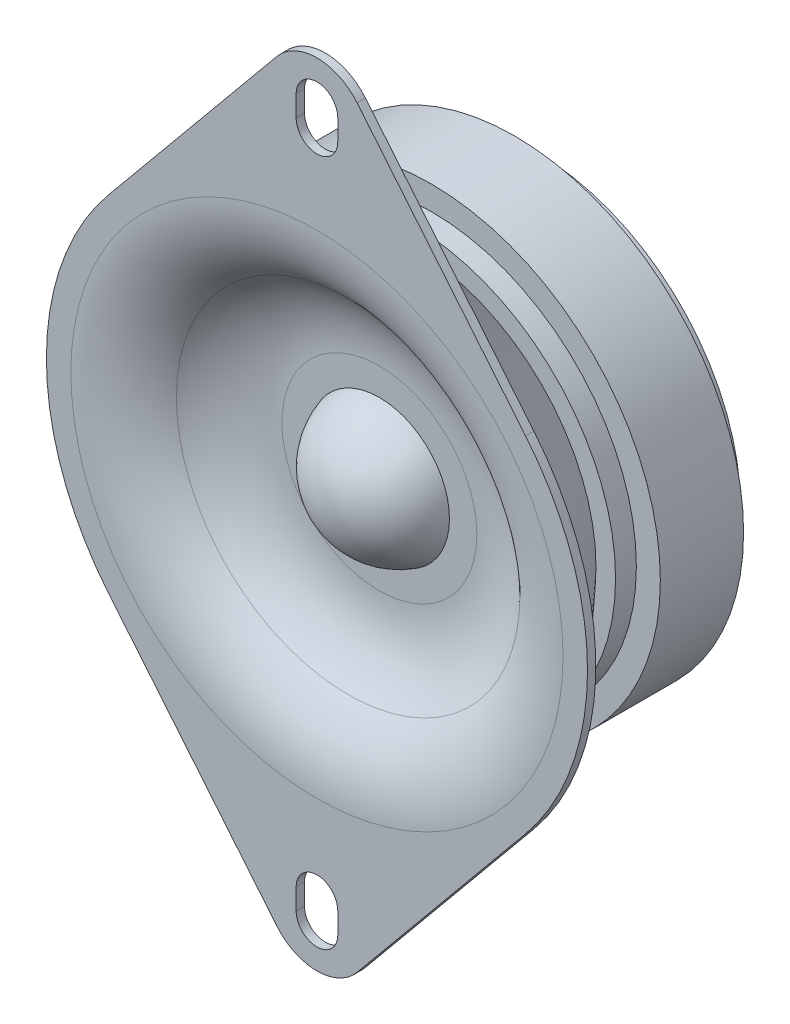
ISO-10303-21;
HEADER;
FILE_DESCRIPTION(('STEP AP214'),'2;1');
FILE_NAME('part.step','',(''),(''),'','','');
FILE_SCHEMA(('AUTOMOTIVE_DESIGN { 1 0 10303 214 1 1 1 1 }'));
ENDSEC;
DATA;
#1=APPLICATION_CONTEXT('core data for automotive mechanical design processes');
#2=APPLICATION_PROTOCOL_DEFINITION('international standard','automotive_design',2000,#1);
#3=PRODUCT_CONTEXT('',#1,'mechanical');
#4=PRODUCT('Part','Part','',(#3));
#5=PRODUCT_RELATED_PRODUCT_CATEGORY('part','',(#4));
#6=PRODUCT_DEFINITION_FORMATION('','',#4);
#7=PRODUCT_DEFINITION_CONTEXT('part definition',#1,'design');
#8=PRODUCT_DEFINITION('design','',#6,#7);
#9=PRODUCT_DEFINITION_SHAPE('','',#8);
#10=(LENGTH_UNIT() NAMED_UNIT(*) SI_UNIT(.MILLI.,.METRE.));
#11=(NAMED_UNIT(*) PLANE_ANGLE_UNIT() SI_UNIT($,.RADIAN.));
#12=(NAMED_UNIT(*) SI_UNIT($,.STERADIAN.) SOLID_ANGLE_UNIT());
#13=UNCERTAINTY_MEASURE_WITH_UNIT(LENGTH_MEASURE(1.E-05),#10,'distance_accuracy_value','');
#14=(GEOMETRIC_REPRESENTATION_CONTEXT(3) GLOBAL_UNCERTAINTY_ASSIGNED_CONTEXT((#13)) GLOBAL_UNIT_ASSIGNED_CONTEXT((#10,
#11,#12)) REPRESENTATION_CONTEXT('',''));
#15=CARTESIAN_POINT('',(0.,0.,0.));
#16=DIRECTION('',(0.,0.,1.));
#17=DIRECTION('',(1.,0.,0.));
#18=AXIS2_PLACEMENT_3D('',#15,#16,#17);
#19=CARTESIAN_POINT('',(0.,0.,-11.));
#20=DIRECTION('',(0.,0.,1.));
#21=DIRECTION('',(1.,0.,0.));
#22=AXIS2_PLACEMENT_3D('',#19,#20,#21);
#23=CONICAL_SURFACE('',#22,16.,0.737815060120465);
#24=CARTESIAN_POINT('',(0.,0.,-9.));
#25=DIRECTION('',(0.,0.,-1.));
#26=DIRECTION('',(-1.,0.,0.));
#27=AXIS2_PLACEMENT_3D('',#24,#25,#26);
#28=CIRCLE('',#27,17.8181818181818);
#29=CARTESIAN_POINT('',(-17.8181818181818,0.,-9.));
#30=VERTEX_POINT('',#29);
#31=EDGE_CURVE('E327',#30,#30,#28,.F.);
#32=ORIENTED_EDGE('',*,*,#31,.T.);
#33=EDGE_LOOP('',(#32));
#34=FACE_BOUND('',#33,.T.);
#35=CARTESIAN_POINT('',(0.,0.,-0.8));
#36=DIRECTION('',(0.,0.,1.));
#37=DIRECTION('',(1.,0.,0.));
#38=AXIS2_PLACEMENT_3D('',#35,#36,#37);
#39=CIRCLE('',#38,25.2727272727273);
#40=CARTESIAN_POINT('',(25.2727272727273,0.,-0.8));
#41=VERTEX_POINT('',#40);
#42=EDGE_CURVE('E241',#41,#41,#39,.F.);
#43=ORIENTED_EDGE('',*,*,#42,.T.);
#44=EDGE_LOOP('',(#43));
#45=FACE_BOUND('',#44,.T.);
#46=ADVANCED_FACE('F31',(#34,#45),#23,.T.);
#47=CARTESIAN_POINT('',(0.,0.,-9.));
#48=DIRECTION('',(0.,0.,-1.));
#49=DIRECTION('',(-1.,0.,0.));
#50=AXIS2_PLACEMENT_3D('',#47,#48,#49);
#51=CYLINDRICAL_SURFACE('',#50,19.6963799452105);
#52=CARTESIAN_POINT('',(0.,0.,-9.));
#53=DIRECTION('',(0.,0.,-1.));
#54=DIRECTION('',(-1.,0.,0.));
#55=AXIS2_PLACEMENT_3D('',#52,#53,#54);
#56=CIRCLE('',#55,19.6963799452105);
#57=CARTESIAN_POINT('',(-19.6963799452105,0.,-9.));
#58=VERTEX_POINT('',#57);
#59=EDGE_CURVE('E334',#58,#58,#56,.T.);
#60=ORIENTED_EDGE('',*,*,#59,.T.);
#61=EDGE_LOOP('',(#60));
#62=FACE_BOUND('',#61,.T.);
#63=CARTESIAN_POINT('',(0.,0.,-11.));
#64=DIRECTION('',(0.,0.,-1.));
#65=DIRECTION('',(-1.,0.,0.));
#66=AXIS2_PLACEMENT_3D('',#63,#64,#65);
#67=CIRCLE('',#66,19.6963799452105);
#68=CARTESIAN_POINT('',(-19.6963799452105,0.,-11.));
#69=VERTEX_POINT('',#68);
#70=EDGE_CURVE('E410',#69,#69,#67,.T.);
#71=ORIENTED_EDGE('',*,*,#70,.F.);
#72=EDGE_LOOP('',(#71));
#73=FACE_BOUND('',#72,.T.);
#74=ADVANCED_FACE('F292',(#62,#73),#51,.T.);
#75=CARTESIAN_POINT('',(0.,0.,-9.));
#76=DIRECTION('',(0.,0.,-1.));
#77=DIRECTION('',(-1.,0.,0.));
#78=AXIS2_PLACEMENT_3D('',#75,#76,#77);
#79=PLANE('',#78);
#80=ORIENTED_EDGE('',*,*,#31,.F.);
#81=EDGE_LOOP('',(#80));
#82=FACE_BOUND('',#81,.T.);
#83=ORIENTED_EDGE('',*,*,#59,.F.);
#84=EDGE_LOOP('',(#83));
#85=FACE_BOUND('',#84,.T.);
#86=ADVANCED_FACE('F288',(#82,#85),#79,.F.);
#87=CARTESIAN_POINT('',(0.,0.,-19.));
#88=DIRECTION('',(0.,0.,-1.));
#89=DIRECTION('',(-1.,0.,0.));
#90=AXIS2_PLACEMENT_3D('',#87,#88,#89);
#91=PLANE('',#90);
#92=CARTESIAN_POINT('',(0.,0.,-19.));
#93=DIRECTION('',(0.,0.,-1.));
#94=DIRECTION('',(-1.,0.,0.));
#95=AXIS2_PLACEMENT_3D('',#92,#93,#94);
#96=CIRCLE('',#95,19.6963799452105);
#97=CARTESIAN_POINT('',(-19.6963799452105,0.,-19.));
#98=VERTEX_POINT('',#97);
#99=EDGE_CURVE('E409',#98,#98,#96,.T.);
#100=ORIENTED_EDGE('',*,*,#99,.F.);
#101=EDGE_LOOP('',(#100));
#102=FACE_BOUND('',#101,.T.);
#103=CARTESIAN_POINT('',(0.,0.,-19.));
#104=DIRECTION('',(0.,0.,-1.));
#105=DIRECTION('',(-1.,0.,0.));
#106=AXIS2_PLACEMENT_3D('',#103,#104,#105);
#107=CIRCLE('',#106,22.);
#108=CARTESIAN_POINT('',(-22.,0.,-19.));
#109=VERTEX_POINT('',#108);
#110=EDGE_CURVE('E395',#109,#109,#107,.T.);
#111=ORIENTED_EDGE('',*,*,#110,.T.);
#112=EDGE_LOOP('',(#111));
#113=FACE_BOUND('',#112,.T.);
#114=ADVANCED_FACE('F291',(#102,#113),#91,.T.);
#115=CARTESIAN_POINT('',(0.,0.,-19.));
#116=DIRECTION('',(0.,0.,1.));
#117=DIRECTION('',(1.,0.,0.));
#118=AXIS2_PLACEMENT_3D('',#115,#116,#117);
#119=CYLINDRICAL_SURFACE('',#118,22.);
#120=ORIENTED_EDGE('',*,*,#110,.F.);
#121=EDGE_LOOP('',(#120));
#122=FACE_BOUND('',#121,.T.);
#123=CARTESIAN_POINT('',(0.,0.,-11.));
#124=DIRECTION('',(0.,0.,-1.));
#125=DIRECTION('',(-1.,0.,0.));
#126=AXIS2_PLACEMENT_3D('',#123,#124,#125);
#127=CIRCLE('',#126,22.);
#128=CARTESIAN_POINT('',(-22.,0.,-11.));
#129=VERTEX_POINT('',#128);
#130=EDGE_CURVE('E413',#129,#129,#127,.T.);
#131=ORIENTED_EDGE('',*,*,#130,.T.);
#132=EDGE_LOOP('',(#131));
#133=FACE_BOUND('',#132,.T.);
#134=ADVANCED_FACE('F300',(#122,#133),#119,.T.);
#135=CARTESIAN_POINT('',(0.,0.,-11.));
#136=DIRECTION('',(0.,0.,-1.));
#137=DIRECTION('',(-1.,0.,0.));
#138=AXIS2_PLACEMENT_3D('',#135,#136,#137);
#139=PLANE('',#138);
#140=ORIENTED_EDGE('',*,*,#70,.T.);
#141=EDGE_LOOP('',(#140));
#142=FACE_BOUND('',#141,.T.);
#143=ORIENTED_EDGE('',*,*,#130,.F.);
#144=EDGE_LOOP('',(#143));
#145=FACE_BOUND('',#144,.T.);
#146=ADVANCED_FACE('F296',(#142,#145),#139,.F.);
#147=ORIENTED_EDGE('',*,*,#99,.T.);
#148=EDGE_LOOP('',(#147));
#149=FACE_BOUND('',#148,.T.);
#150=CARTESIAN_POINT('',(0.,0.,-21.));
#151=DIRECTION('',(0.,0.,-1.));
#152=DIRECTION('',(-1.,0.,0.));
#153=AXIS2_PLACEMENT_3D('',#150,#151,#152);
#154=CIRCLE('',#153,19.6963799452105);
#155=CARTESIAN_POINT('',(-19.6963799452105,0.,-21.));
#156=VERTEX_POINT('',#155);
#157=EDGE_CURVE('E331',#156,#156,#154,.T.);
#158=ORIENTED_EDGE('',*,*,#157,.F.);
#159=EDGE_LOOP('',(#158));
#160=FACE_BOUND('',#159,.T.);
#161=ADVANCED_FACE('F286',(#149,#160),#51,.T.);
#162=CARTESIAN_POINT('',(0.,0.,-21.));
#163=DIRECTION('',(0.,0.,-1.));
#164=DIRECTION('',(-1.,0.,0.));
#165=AXIS2_PLACEMENT_3D('',#162,#163,#164);
#166=PLANE('',#165);
#167=ORIENTED_EDGE('',*,*,#157,.T.);
#168=EDGE_LOOP('',(#167));
#169=FACE_BOUND('',#168,.T.);
#170=ADVANCED_FACE('F276',(#169),#166,.T.);
#171=CARTESIAN_POINT('',(0.,0.,-0.8));
#172=DIRECTION('',(0.,0.,1.));
#173=DIRECTION('',(1.,0.,0.));
#174=AXIS2_PLACEMENT_3D('',#171,#172,#173);
#175=CYLINDRICAL_SURFACE('',#174,26.);
#176=CARTESIAN_POINT('',(0.,0.,0.));
#177=DIRECTION('',(0.,0.,1.));
#178=DIRECTION('',(1.,0.,0.));
#179=AXIS2_PLACEMENT_3D('',#176,#177,#178);
#180=CIRCLE('',#179,26.);
#181=CARTESIAN_POINT('',(-20.0381492562458,16.569280212315,0.));
#182=VERTEX_POINT('',#181);
#183=CARTESIAN_POINT('',(-20.0381912646077,-16.5691694476718,0.));
#184=VERTEX_POINT('',#183);
#185=EDGE_CURVE('E36',#182,#184,#180,.T.);
#186=ORIENTED_EDGE('',*,*,#185,.F.);
#187=DIRECTION('',(0.,0.,1.));
#188=VECTOR('',#187,1.);
#189=CARTESIAN_POINT('',(-20.0561196118366,16.5454545454545,-0.8));
#190=LINE('',#189,#188);
#191=CARTESIAN_POINT('',(-20.0561196118366,16.5454545454545,-0.8));
#192=VERTEX_POINT('',#191);
#193=EDGE_CURVE('E239',#192,#182,#190,.T.);
#194=ORIENTED_EDGE('',*,*,#193,.F.);
#195=CARTESIAN_POINT('',(0.,0.,-0.8));
#196=DIRECTION('',(0.,0.,1.));
#197=DIRECTION('',(1.,0.,0.));
#198=AXIS2_PLACEMENT_3D('',#195,#196,#197);
#199=CIRCLE('',#198,26.);
#200=CARTESIAN_POINT('',(-20.0561196118366,-16.5454545454545,-0.8));
#201=VERTEX_POINT('',#200);
#202=EDGE_CURVE('E235',#192,#201,#199,.T.);
#203=ORIENTED_EDGE('',*,*,#202,.T.);
#204=DIRECTION('',(0.,0.,1.));
#205=VECTOR('',#204,1.);
#206=CARTESIAN_POINT('',(-20.0561196118366,-16.5454545454545,-0.8));
#207=LINE('',#206,#205);
#208=EDGE_CURVE('E356',#201,#184,#207,.T.);
#209=ORIENTED_EDGE('',*,*,#208,.T.);
#210=EDGE_LOOP('',(#186,#194,#203,#209));
#211=FACE_BOUND('',#210,.T.);
#212=ADVANCED_FACE('F265',(#211),#175,.T.);
#213=CARTESIAN_POINT('',(-3.85694607919935,36.1818181818182,-0.8));
#214=DIRECTION('',(-0.77138921583987,0.636363636363636,0.));
#215=DIRECTION('',(-0.636363636363636,-0.77138921583987,0.));
#216=AXIS2_PLACEMENT_3D('',#213,#214,#215);
#217=PLANE('',#216);
#218=DIRECTION('',(-0.636363636363636,-0.77138921583987,0.));
#219=VECTOR('',#218,1.);
#220=CARTESIAN_POINT('',(-3.85694607919935,36.1818181818182,0.));
#221=LINE('',#220,#219);
#222=CARTESIAN_POINT('',(-3.85694607919935,36.1818181818182,0.));
#223=VERTEX_POINT('',#222);
#224=EDGE_CURVE('E232',#223,#182,#221,.T.);
#225=ORIENTED_EDGE('',*,*,#224,.F.);
#226=DIRECTION('',(0.,0.,1.));
#227=VECTOR('',#226,1.);
#228=CARTESIAN_POINT('',(-3.85694607919935,36.1818181818182,-0.8));
#229=LINE('',#228,#227);
#230=CARTESIAN_POINT('',(-3.85694607919935,36.1818181818182,-0.8));
#231=VERTEX_POINT('',#230);
#232=EDGE_CURVE('E242',#231,#223,#229,.T.);
#233=ORIENTED_EDGE('',*,*,#232,.F.);
#234=DIRECTION('',(-0.636363636363636,-0.77138921583987,0.));
#235=VECTOR('',#234,1.);
#236=CARTESIAN_POINT('',(-3.85694607919935,36.1818181818182,-0.8));
#237=LINE('',#236,#235);
#238=EDGE_CURVE('E362',#231,#192,#237,.T.);
#239=ORIENTED_EDGE('',*,*,#238,.T.);
#240=ORIENTED_EDGE('',*,*,#193,.T.);
#241=EDGE_LOOP('',(#225,#233,#239,#240));
#242=FACE_BOUND('',#241,.T.);
#243=ADVANCED_FACE('F275',(#242),#217,.T.);
#244=CARTESIAN_POINT('',(0.,33.,-0.8));
#245=DIRECTION('',(0.,0.,1.));
#246=DIRECTION('',(1.,0.,0.));
#247=AXIS2_PLACEMENT_3D('',#244,#245,#246);
#248=CYLINDRICAL_SURFACE('',#247,5.);
#249=CARTESIAN_POINT('',(0.,33.,0.));
#250=DIRECTION('',(0.,0.,1.));
#251=DIRECTION('',(1.,0.,0.));
#252=AXIS2_PLACEMENT_3D('',#249,#250,#251);
#253=CIRCLE('',#252,5.);
#254=CARTESIAN_POINT('',(3.85694607919936,36.1818181818182,0.));
#255=VERTEX_POINT('',#254);
#256=EDGE_CURVE('E229',#255,#223,#253,.T.);
#257=ORIENTED_EDGE('',*,*,#256,.F.);
#258=DIRECTION('',(0.,0.,1.));
#259=VECTOR('',#258,1.);
#260=CARTESIAN_POINT('',(3.85694607919936,36.1818181818182,-0.8));
#261=LINE('',#260,#259);
#262=CARTESIAN_POINT('',(3.85694607919936,36.1818181818182,-0.8));
#263=VERTEX_POINT('',#262);
#264=EDGE_CURVE('E358',#263,#255,#261,.T.);
#265=ORIENTED_EDGE('',*,*,#264,.F.);
#266=CARTESIAN_POINT('',(0.,33.,-0.8));
#267=DIRECTION('',(0.,0.,1.));
#268=DIRECTION('',(1.,0.,0.));
#269=AXIS2_PLACEMENT_3D('',#266,#267,#268);
#270=CIRCLE('',#269,5.);
#271=EDGE_CURVE('E365',#263,#231,#270,.T.);
#272=ORIENTED_EDGE('',*,*,#271,.T.);
#273=ORIENTED_EDGE('',*,*,#232,.T.);
#274=EDGE_LOOP('',(#257,#265,#272,#273));
#275=FACE_BOUND('',#274,.T.);
#276=ADVANCED_FACE('F386',(#275),#248,.T.);
#277=CARTESIAN_POINT('',(3.85694607919935,36.1818181818182,-0.8));
#278=DIRECTION('',(0.77138921583987,0.636363636363636,0.));
#279=DIRECTION('',(-0.636363636363636,0.77138921583987,0.));
#280=AXIS2_PLACEMENT_3D('',#277,#278,#279);
#281=PLANE('',#280);
#282=DIRECTION('',(-0.636363636363636,0.77138921583987,0.));
#283=VECTOR('',#282,1.);
#284=CARTESIAN_POINT('',(3.85694607919935,36.1818181818182,0.));
#285=LINE('',#284,#283);
#286=CARTESIAN_POINT('',(20.0381912746465,16.5691694355498,0.));
#287=VERTEX_POINT('',#286);
#288=EDGE_CURVE('E223',#287,#255,#285,.T.);
#289=ORIENTED_EDGE('',*,*,#288,.F.);
#290=DIRECTION('',(0.,0.,1.));
#291=VECTOR('',#290,1.);
#292=CARTESIAN_POINT('',(20.0561196118366,16.5454545454545,-0.8));
#293=LINE('',#292,#291);
#294=CARTESIAN_POINT('',(20.0561196118366,16.5454545454545,-0.8));
#295=VERTEX_POINT('',#294);
#296=EDGE_CURVE('E50',#295,#287,#293,.T.);
#297=ORIENTED_EDGE('',*,*,#296,.F.);
#298=DIRECTION('',(-0.636363636363636,0.77138921583987,0.));
#299=VECTOR('',#298,1.);
#300=CARTESIAN_POINT('',(3.85694607919935,36.1818181818182,-0.8));
#301=LINE('',#300,#299);
#302=EDGE_CURVE('E368',#295,#263,#301,.T.);
#303=ORIENTED_EDGE('',*,*,#302,.T.);
#304=ORIENTED_EDGE('',*,*,#264,.T.);
#305=EDGE_LOOP('',(#289,#297,#303,#304));
#306=FACE_BOUND('',#305,.T.);
#307=ADVANCED_FACE('F389',(#306),#281,.T.);
#308=CARTESIAN_POINT('',(0.,0.,-0.8));
#309=DIRECTION('',(0.,0.,1.));
#310=DIRECTION('',(1.,0.,0.));
#311=AXIS2_PLACEMENT_3D('',#308,#309,#310);
#312=CYLINDRICAL_SURFACE('',#311,26.);
#313=CARTESIAN_POINT('',(0.,0.,0.));
#314=DIRECTION('',(0.,0.,1.));
#315=DIRECTION('',(1.,0.,0.));
#316=AXIS2_PLACEMENT_3D('',#313,#314,#315);
#317=CIRCLE('',#316,26.);
#318=CARTESIAN_POINT('',(20.0381492562515,-16.5692802123089,0.));
#319=VERTEX_POINT('',#318);
#320=EDGE_CURVE('E222',#319,#287,#317,.T.);
#321=ORIENTED_EDGE('',*,*,#320,.F.);
#322=DIRECTION('',(0.,0.,1.));
#323=VECTOR('',#322,1.);
#324=CARTESIAN_POINT('',(20.0561196118366,-16.5454545454545,-0.8));
#325=LINE('',#324,#323);
#326=CARTESIAN_POINT('',(20.0561196118366,-16.5454545454545,-0.8));
#327=VERTEX_POINT('',#326);
#328=EDGE_CURVE('E246',#327,#319,#325,.T.);
#329=ORIENTED_EDGE('',*,*,#328,.F.);
#330=CARTESIAN_POINT('',(0.,0.,-0.8));
#331=DIRECTION('',(0.,0.,1.));
#332=DIRECTION('',(1.,0.,0.));
#333=AXIS2_PLACEMENT_3D('',#330,#331,#332);
#334=CIRCLE('',#333,26.);
#335=EDGE_CURVE('E371',#327,#295,#334,.T.);
#336=ORIENTED_EDGE('',*,*,#335,.T.);
#337=ORIENTED_EDGE('',*,*,#296,.T.);
#338=EDGE_LOOP('',(#321,#329,#336,#337));
#339=FACE_BOUND('',#338,.T.);
#340=ADVANCED_FACE('F339',(#339),#312,.T.);
#341=CARTESIAN_POINT('',(3.85694607919935,-36.1818181818182,-0.8));
#342=DIRECTION('',(0.77138921583987,-0.636363636363636,0.));
#343=DIRECTION('',(0.636363636363636,0.77138921583987,0.));
#344=AXIS2_PLACEMENT_3D('',#341,#342,#343);
#345=PLANE('',#344);
#346=DIRECTION('',(0.636363636363636,0.77138921583987,0.));
#347=VECTOR('',#346,1.);
#348=CARTESIAN_POINT('',(3.85694607919935,-36.1818181818182,0.));
#349=LINE('',#348,#347);
#350=CARTESIAN_POINT('',(3.85694607919935,-36.1818181818182,0.));
#351=VERTEX_POINT('',#350);
#352=EDGE_CURVE('E219',#351,#319,#349,.T.);
#353=ORIENTED_EDGE('',*,*,#352,.F.);
#354=DIRECTION('',(0.,0.,1.));
#355=VECTOR('',#354,1.);
#356=CARTESIAN_POINT('',(3.85694607919935,-36.1818181818182,-0.8));
#357=LINE('',#356,#355);
#358=CARTESIAN_POINT('',(3.85694607919935,-36.1818181818182,-0.8));
#359=VERTEX_POINT('',#358);
#360=EDGE_CURVE('E249',#359,#351,#357,.T.);
#361=ORIENTED_EDGE('',*,*,#360,.F.);
#362=DIRECTION('',(0.636363636363636,0.77138921583987,0.));
#363=VECTOR('',#362,1.);
#364=CARTESIAN_POINT('',(3.85694607919935,-36.1818181818182,-0.8));
#365=LINE('',#364,#363);
#366=EDGE_CURVE('E348',#359,#327,#365,.T.);
#367=ORIENTED_EDGE('',*,*,#366,.T.);
#368=ORIENTED_EDGE('',*,*,#328,.T.);
#369=EDGE_LOOP('',(#353,#361,#367,#368));
#370=FACE_BOUND('',#369,.T.);
#371=ADVANCED_FACE('F345',(#370),#345,.T.);
#372=CARTESIAN_POINT('',(0.,-33.,-0.8));
#373=DIRECTION('',(0.,0.,1.));
#374=DIRECTION('',(1.,0.,0.));
#375=AXIS2_PLACEMENT_3D('',#372,#373,#374);
#376=CYLINDRICAL_SURFACE('',#375,5.);
#377=CARTESIAN_POINT('',(0.,-33.,0.));
#378=DIRECTION('',(0.,0.,1.));
#379=DIRECTION('',(-1.,0.,0.));
#380=AXIS2_PLACEMENT_3D('',#377,#378,#379);
#381=CIRCLE('',#380,5.);
#382=CARTESIAN_POINT('',(-3.85694607919935,-36.1818181818182,0.));
#383=VERTEX_POINT('',#382);
#384=EDGE_CURVE('E212',#383,#351,#381,.T.);
#385=ORIENTED_EDGE('',*,*,#384,.F.);
#386=DIRECTION('',(0.,0.,1.));
#387=VECTOR('',#386,1.);
#388=CARTESIAN_POINT('',(-3.85694607919935,-36.1818181818182,-0.8));
#389=LINE('',#388,#387);
#390=CARTESIAN_POINT('',(-3.85694607919935,-36.1818181818182,-0.8));
#391=VERTEX_POINT('',#390);
#392=EDGE_CURVE('E217',#391,#383,#389,.T.);
#393=ORIENTED_EDGE('',*,*,#392,.F.);
#394=CARTESIAN_POINT('',(0.,-33.,-0.8));
#395=DIRECTION('',(0.,0.,1.));
#396=DIRECTION('',(-1.,0.,0.));
#397=AXIS2_PLACEMENT_3D('',#394,#395,#396);
#398=CIRCLE('',#397,5.);
#399=EDGE_CURVE('E355',#391,#359,#398,.T.);
#400=ORIENTED_EDGE('',*,*,#399,.T.);
#401=ORIENTED_EDGE('',*,*,#360,.T.);
#402=EDGE_LOOP('',(#385,#393,#400,#401));
#403=FACE_BOUND('',#402,.T.);
#404=ADVANCED_FACE('F352',(#403),#376,.T.);
#405=CARTESIAN_POINT('',(-3.85694607919935,-36.1818181818182,-0.8));
#406=DIRECTION('',(-0.77138921583987,-0.636363636363636,0.));
#407=DIRECTION('',(0.636363636363636,-0.77138921583987,0.));
#408=AXIS2_PLACEMENT_3D('',#405,#406,#407);
#409=PLANE('',#408);
#410=DIRECTION('',(0.636363636363636,-0.77138921583987,0.));
#411=VECTOR('',#410,1.);
#412=CARTESIAN_POINT('',(-3.85694607919935,-36.1818181818182,0.));
#413=LINE('',#412,#411);
#414=EDGE_CURVE('E73',#184,#383,#413,.T.);
#415=ORIENTED_EDGE('',*,*,#414,.F.);
#416=ORIENTED_EDGE('',*,*,#208,.F.);
#417=DIRECTION('',(0.636363636363636,-0.77138921583987,0.));
#418=VECTOR('',#417,1.);
#419=CARTESIAN_POINT('',(-3.85694607919935,-36.1818181818182,-0.8));
#420=LINE('',#419,#418);
#421=EDGE_CURVE('E374',#201,#391,#420,.T.);
#422=ORIENTED_EDGE('',*,*,#421,.T.);
#423=ORIENTED_EDGE('',*,*,#392,.T.);
#424=EDGE_LOOP('',(#415,#416,#422,#423));
#425=FACE_BOUND('',#424,.T.);
#426=ADVANCED_FACE('F277',(#425),#409,.T.);
#427=CARTESIAN_POINT('',(0.,0.,-0.8));
#428=DIRECTION('',(0.,0.,1.));
#429=DIRECTION('',(1.,0.,0.));
#430=AXIS2_PLACEMENT_3D('',#427,#428,#429);
#431=PLANE('',#430);
#432=ORIENTED_EDGE('',*,*,#42,.F.);
#433=EDGE_LOOP('',(#432));
#434=FACE_BOUND('',#433,.T.);
#435=DIRECTION('',(0.,1.,0.));
#436=VECTOR('',#435,1.);
#437=CARTESIAN_POINT('',(2.00000000000001,34.,-0.8));
#438=LINE('',#437,#436);
#439=CARTESIAN_POINT('',(2.00000000000001,32.,-0.8));
#440=VERTEX_POINT('',#439);
#441=CARTESIAN_POINT('',(2.00000000000001,34.,-0.8));
#442=VERTEX_POINT('',#441);
#443=EDGE_CURVE('E151',#440,#442,#438,.T.);
#444=ORIENTED_EDGE('',*,*,#443,.T.);
#445=CARTESIAN_POINT('',(0.,34.,-0.8));
#446=DIRECTION('',(0.,0.,1.));
#447=DIRECTION('',(1.,0.,0.));
#448=AXIS2_PLACEMENT_3D('',#445,#446,#447);
#449=CIRCLE('',#448,2.00000000000001);
#450=CARTESIAN_POINT('',(-2.00000000000001,34.,-0.8));
#451=VERTEX_POINT('',#450);
#452=EDGE_CURVE('E167',#442,#451,#449,.T.);
#453=ORIENTED_EDGE('',*,*,#452,.T.);
#454=DIRECTION('',(0.,-1.,0.));
#455=VECTOR('',#454,1.);
#456=CARTESIAN_POINT('',(-2.00000000000001,34.,-0.8));
#457=LINE('',#456,#455);
#458=CARTESIAN_POINT('',(-2.00000000000001,32.,-0.8));
#459=VERTEX_POINT('',#458);
#460=EDGE_CURVE('E152',#451,#459,#457,.T.);
#461=ORIENTED_EDGE('',*,*,#460,.T.);
#462=CARTESIAN_POINT('',(0.,32.,-0.8));
#463=DIRECTION('',(0.,0.,1.));
#464=DIRECTION('',(1.,0.,0.));
#465=AXIS2_PLACEMENT_3D('',#462,#463,#464);
#466=CIRCLE('',#465,2.00000000000001);
#467=EDGE_CURVE('E137',#459,#440,#466,.T.);
#468=ORIENTED_EDGE('',*,*,#467,.T.);
#469=EDGE_LOOP('',(#444,#453,#461,#468));
#470=FACE_BOUND('',#469,.T.);
#471=DIRECTION('',(0.,1.,0.));
#472=VECTOR('',#471,1.);
#473=CARTESIAN_POINT('',(2.00000000000001,-34.,-0.8));
#474=LINE('',#473,#472);
#475=CARTESIAN_POINT('',(2.00000000000001,-34.,-0.8));
#476=VERTEX_POINT('',#475);
#477=CARTESIAN_POINT('',(2.00000000000001,-32.,-0.8));
#478=VERTEX_POINT('',#477);
#479=EDGE_CURVE('E197',#476,#478,#474,.T.);
#480=ORIENTED_EDGE('',*,*,#479,.T.);
#481=CARTESIAN_POINT('',(0.,-32.,-0.8));
#482=DIRECTION('',(0.,0.,1.));
#483=DIRECTION('',(-1.,0.,0.));
#484=AXIS2_PLACEMENT_3D('',#481,#482,#483);
#485=CIRCLE('',#484,2.00000000000001);
#486=CARTESIAN_POINT('',(-2.00000000000001,-32.,-0.8));
#487=VERTEX_POINT('',#486);
#488=EDGE_CURVE('E188',#478,#487,#485,.T.);
#489=ORIENTED_EDGE('',*,*,#488,.T.);
#490=DIRECTION('',(0.,-1.,0.));
#491=VECTOR('',#490,1.);
#492=CARTESIAN_POINT('',(-2.00000000000001,-34.,-0.8));
#493=LINE('',#492,#491);
#494=CARTESIAN_POINT('',(-2.00000000000001,-34.,-0.8));
#495=VERTEX_POINT('',#494);
#496=EDGE_CURVE('E191',#487,#495,#493,.T.);
#497=ORIENTED_EDGE('',*,*,#496,.T.);
#498=CARTESIAN_POINT('',(0.,-34.,-0.8));
#499=DIRECTION('',(0.,0.,1.));
#500=DIRECTION('',(-1.,0.,0.));
#501=AXIS2_PLACEMENT_3D('',#498,#499,#500);
#502=CIRCLE('',#501,2.00000000000001);
#503=EDGE_CURVE('E194',#495,#476,#502,.T.);
#504=ORIENTED_EDGE('',*,*,#503,.T.);
#505=EDGE_LOOP('',(#480,#489,#497,#504));
#506=FACE_BOUND('',#505,.T.);
#507=ORIENTED_EDGE('',*,*,#202,.F.);
#508=ORIENTED_EDGE('',*,*,#238,.F.);
#509=ORIENTED_EDGE('',*,*,#271,.F.);
#510=ORIENTED_EDGE('',*,*,#302,.F.);
#511=ORIENTED_EDGE('',*,*,#335,.F.);
#512=ORIENTED_EDGE('',*,*,#366,.F.);
#513=ORIENTED_EDGE('',*,*,#399,.F.);
#514=ORIENTED_EDGE('',*,*,#421,.F.);
#515=EDGE_LOOP('',(#507,#508,#509,#510,#511,#512,#513,#514));
#516=FACE_BOUND('',#515,.T.);
#517=ADVANCED_FACE('F164',(#434,#470,#506,#516),#431,.F.);
#518=CARTESIAN_POINT('',(0.,-32.,-0.8));
#519=DIRECTION('',(0.,0.,1.));
#520=DIRECTION('',(1.,0.,0.));
#521=AXIS2_PLACEMENT_3D('',#518,#519,#520);
#522=CYLINDRICAL_SURFACE('',#521,2.00000000000001);
#523=CARTESIAN_POINT('',(0.,-32.,0.));
#524=DIRECTION('',(0.,0.,1.));
#525=DIRECTION('',(-1.,0.,0.));
#526=AXIS2_PLACEMENT_3D('',#523,#524,#525);
#527=CIRCLE('',#526,2.00000000000001);
#528=CARTESIAN_POINT('',(2.00000000000001,-32.,0.));
#529=VERTEX_POINT('',#528);
#530=CARTESIAN_POINT('',(-2.00000000000001,-32.,0.));
#531=VERTEX_POINT('',#530);
#532=EDGE_CURVE('E176',#529,#531,#527,.T.);
#533=ORIENTED_EDGE('',*,*,#532,.T.);
#534=DIRECTION('',(0.,0.,1.));
#535=VECTOR('',#534,1.);
#536=CARTESIAN_POINT('',(-2.00000000000001,-32.,-0.8));
#537=LINE('',#536,#535);
#538=EDGE_CURVE('E200',#487,#531,#537,.T.);
#539=ORIENTED_EDGE('',*,*,#538,.F.);
#540=ORIENTED_EDGE('',*,*,#488,.F.);
#541=DIRECTION('',(0.,0.,1.));
#542=VECTOR('',#541,1.);
#543=CARTESIAN_POINT('',(2.00000000000001,-32.,-0.8));
#544=LINE('',#543,#542);
#545=EDGE_CURVE('E83',#478,#529,#544,.T.);
#546=ORIENTED_EDGE('',*,*,#545,.T.);
#547=EDGE_LOOP('',(#533,#539,#540,#546));
#548=FACE_BOUND('',#547,.T.);
#549=ADVANCED_FACE('F461',(#548),#522,.F.);
#550=CARTESIAN_POINT('',(2.00000000000001,-34.,-0.8));
#551=DIRECTION('',(1.,0.,0.));
#552=DIRECTION('',(0.,0.,-1.));
#553=AXIS2_PLACEMENT_3D('',#550,#551,#552);
#554=PLANE('',#553);
#555=DIRECTION('',(0.,1.,0.));
#556=VECTOR('',#555,1.);
#557=CARTESIAN_POINT('',(2.00000000000001,-34.,0.));
#558=LINE('',#557,#556);
#559=CARTESIAN_POINT('',(2.00000000000001,-34.,0.));
#560=VERTEX_POINT('',#559);
#561=EDGE_CURVE('E186',#560,#529,#558,.T.);
#562=ORIENTED_EDGE('',*,*,#561,.T.);
#563=ORIENTED_EDGE('',*,*,#545,.F.);
#564=ORIENTED_EDGE('',*,*,#479,.F.);
#565=DIRECTION('',(0.,0.,1.));
#566=VECTOR('',#565,1.);
#567=CARTESIAN_POINT('',(2.00000000000001,-34.,-0.8));
#568=LINE('',#567,#566);
#569=EDGE_CURVE('E202',#476,#560,#568,.T.);
#570=ORIENTED_EDGE('',*,*,#569,.T.);
#571=EDGE_LOOP('',(#562,#563,#564,#570));
#572=FACE_BOUND('',#571,.T.);
#573=ADVANCED_FACE('F466',(#572),#554,.F.);
#574=CARTESIAN_POINT('',(0.,-34.,-0.8));
#575=DIRECTION('',(0.,0.,1.));
#576=DIRECTION('',(1.,0.,0.));
#577=AXIS2_PLACEMENT_3D('',#574,#575,#576);
#578=CYLINDRICAL_SURFACE('',#577,2.00000000000001);
#579=CARTESIAN_POINT('',(0.,-34.,0.));
#580=DIRECTION('',(0.,0.,1.));
#581=DIRECTION('',(-1.,0.,0.));
#582=AXIS2_PLACEMENT_3D('',#579,#580,#581);
#583=CIRCLE('',#582,2.00000000000001);
#584=CARTESIAN_POINT('',(-2.00000000000001,-34.,0.));
#585=VERTEX_POINT('',#584);
#586=EDGE_CURVE('E183',#585,#560,#583,.T.);
#587=ORIENTED_EDGE('',*,*,#586,.T.);
#588=ORIENTED_EDGE('',*,*,#569,.F.);
#589=ORIENTED_EDGE('',*,*,#503,.F.);
#590=DIRECTION('',(0.,0.,1.));
#591=VECTOR('',#590,1.);
#592=CARTESIAN_POINT('',(-2.00000000000001,-34.,-0.8));
#593=LINE('',#592,#591);
#594=EDGE_CURVE('E205',#495,#585,#593,.T.);
#595=ORIENTED_EDGE('',*,*,#594,.T.);
#596=EDGE_LOOP('',(#587,#588,#589,#595));
#597=FACE_BOUND('',#596,.T.);
#598=ADVANCED_FACE('F506',(#597),#578,.F.);
#599=CARTESIAN_POINT('',(-2.00000000000001,-34.,-0.8));
#600=DIRECTION('',(-1.,0.,0.));
#601=DIRECTION('',(0.,0.,1.));
#602=AXIS2_PLACEMENT_3D('',#599,#600,#601);
#603=PLANE('',#602);
#604=DIRECTION('',(0.,-1.,0.));
#605=VECTOR('',#604,1.);
#606=CARTESIAN_POINT('',(-2.00000000000001,-34.,0.));
#607=LINE('',#606,#605);
#608=EDGE_CURVE('E180',#531,#585,#607,.T.);
#609=ORIENTED_EDGE('',*,*,#608,.T.);
#610=ORIENTED_EDGE('',*,*,#594,.F.);
#611=ORIENTED_EDGE('',*,*,#496,.F.);
#612=ORIENTED_EDGE('',*,*,#538,.T.);
#613=EDGE_LOOP('',(#609,#610,#611,#612));
#614=FACE_BOUND('',#613,.T.);
#615=ADVANCED_FACE('F513',(#614),#603,.F.);
#616=CARTESIAN_POINT('',(0.,34.,-0.8));
#617=DIRECTION('',(0.,0.,1.));
#618=DIRECTION('',(1.,0.,0.));
#619=AXIS2_PLACEMENT_3D('',#616,#617,#618);
#620=CYLINDRICAL_SURFACE('',#619,2.00000000000001);
#621=CARTESIAN_POINT('',(0.,34.,0.));
#622=DIRECTION('',(0.,0.,1.));
#623=DIRECTION('',(1.,0.,0.));
#624=AXIS2_PLACEMENT_3D('',#621,#622,#623);
#625=CIRCLE('',#624,2.00000000000001);
#626=CARTESIAN_POINT('',(2.00000000000001,34.,0.));
#627=VERTEX_POINT('',#626);
#628=CARTESIAN_POINT('',(-2.00000000000001,34.,0.));
#629=VERTEX_POINT('',#628);
#630=EDGE_CURVE('E130',#627,#629,#625,.T.);
#631=ORIENTED_EDGE('',*,*,#630,.T.);
#632=DIRECTION('',(0.,0.,1.));
#633=VECTOR('',#632,1.);
#634=CARTESIAN_POINT('',(-2.00000000000001,34.,-0.8));
#635=LINE('',#634,#633);
#636=EDGE_CURVE('E162',#451,#629,#635,.T.);
#637=ORIENTED_EDGE('',*,*,#636,.F.);
#638=ORIENTED_EDGE('',*,*,#452,.F.);
#639=DIRECTION('',(0.,0.,1.));
#640=VECTOR('',#639,1.);
#641=CARTESIAN_POINT('',(2.00000000000001,34.,-0.8));
#642=LINE('',#641,#640);
#643=EDGE_CURVE('E174',#442,#627,#642,.T.);
#644=ORIENTED_EDGE('',*,*,#643,.T.);
#645=EDGE_LOOP('',(#631,#637,#638,#644));
#646=FACE_BOUND('',#645,.T.);
#647=ADVANCED_FACE('F521',(#646),#620,.F.);
#648=CARTESIAN_POINT('',(2.00000000000001,34.,-0.8));
#649=DIRECTION('',(1.,0.,0.));
#650=DIRECTION('',(0.,0.,-1.));
#651=AXIS2_PLACEMENT_3D('',#648,#649,#650);
#652=PLANE('',#651);
#653=DIRECTION('',(0.,1.,0.));
#654=VECTOR('',#653,1.);
#655=CARTESIAN_POINT('',(2.00000000000001,34.,0.));
#656=LINE('',#655,#654);
#657=CARTESIAN_POINT('',(2.00000000000001,32.,0.));
#658=VERTEX_POINT('',#657);
#659=EDGE_CURVE('E169',#658,#627,#656,.T.);
#660=ORIENTED_EDGE('',*,*,#659,.T.);
#661=ORIENTED_EDGE('',*,*,#643,.F.);
#662=ORIENTED_EDGE('',*,*,#443,.F.);
#663=DIRECTION('',(0.,0.,1.));
#664=VECTOR('',#663,1.);
#665=CARTESIAN_POINT('',(2.00000000000001,32.,-0.8));
#666=LINE('',#665,#664);
#667=EDGE_CURVE('E146',#440,#658,#666,.T.);
#668=ORIENTED_EDGE('',*,*,#667,.T.);
#669=EDGE_LOOP('',(#660,#661,#662,#668));
#670=FACE_BOUND('',#669,.T.);
#671=ADVANCED_FACE('F528',(#670),#652,.F.);
#672=CARTESIAN_POINT('',(0.,32.,-0.8));
#673=DIRECTION('',(0.,0.,1.));
#674=DIRECTION('',(1.,0.,0.));
#675=AXIS2_PLACEMENT_3D('',#672,#673,#674);
#676=CYLINDRICAL_SURFACE('',#675,2.00000000000001);
#677=CARTESIAN_POINT('',(0.,32.,0.));
#678=DIRECTION('',(0.,0.,1.));
#679=DIRECTION('',(1.,0.,0.));
#680=AXIS2_PLACEMENT_3D('',#677,#678,#679);
#681=CIRCLE('',#680,2.00000000000001);
#682=CARTESIAN_POINT('',(-2.00000000000001,32.,0.));
#683=VERTEX_POINT('',#682);
#684=EDGE_CURVE('E614',#683,#658,#681,.T.);
#685=ORIENTED_EDGE('',*,*,#684,.T.);
#686=ORIENTED_EDGE('',*,*,#667,.F.);
#687=ORIENTED_EDGE('',*,*,#467,.F.);
#688=DIRECTION('',(0.,0.,1.));
#689=VECTOR('',#688,1.);
#690=CARTESIAN_POINT('',(-2.00000000000001,32.,-0.8));
#691=LINE('',#690,#689);
#692=EDGE_CURVE('E142',#459,#683,#691,.T.);
#693=ORIENTED_EDGE('',*,*,#692,.T.);
#694=EDGE_LOOP('',(#685,#686,#687,#693));
#695=FACE_BOUND('',#694,.T.);
#696=ADVANCED_FACE('F140',(#695),#676,.F.);
#697=CARTESIAN_POINT('',(-2.00000000000001,34.,-0.8));
#698=DIRECTION('',(-1.,0.,0.));
#699=DIRECTION('',(0.,0.,1.));
#700=AXIS2_PLACEMENT_3D('',#697,#698,#699);
#701=PLANE('',#700);
#702=DIRECTION('',(0.,-1.,0.));
#703=VECTOR('',#702,1.);
#704=CARTESIAN_POINT('',(-2.00000000000001,34.,0.));
#705=LINE('',#704,#703);
#706=EDGE_CURVE('E160',#629,#683,#705,.T.);
#707=ORIENTED_EDGE('',*,*,#706,.T.);
#708=ORIENTED_EDGE('',*,*,#692,.F.);
#709=ORIENTED_EDGE('',*,*,#460,.F.);
#710=ORIENTED_EDGE('',*,*,#636,.T.);
#711=EDGE_LOOP('',(#707,#708,#709,#710));
#712=FACE_BOUND('',#711,.T.);
#713=ADVANCED_FACE('F156',(#712),#701,.F.);
#714=CARTESIAN_POINT('',(0.,0.,-7.91858132045463));
#715=DIRECTION('',(0.,0.,1.));
#716=DIRECTION('',(-1.,0.,0.));
#717=AXIS2_PLACEMENT_3D('',#714,#715,#716);
#718=SPHERICAL_SURFACE('',#717,7.);
#719=CARTESIAN_POINT('',(0.,0.,-6.));
#720=DIRECTION('',(0.,0.,1.));
#721=DIRECTION('',(1.,0.,0.));
#722=AXIS2_PLACEMENT_3D('',#719,#720,#721);
#723=CIRCLE('',#722,6.7319421949986);
#724=CARTESIAN_POINT('',(6.7319421949986,0.,-6.));
#725=VERTEX_POINT('',#724);
#726=EDGE_CURVE('E406',#725,#725,#723,.T.);
#727=ORIENTED_EDGE('',*,*,#726,.T.);
#728=EDGE_LOOP('',(#727));
#729=FACE_BOUND('',#728,.T.);
#730=ADVANCED_FACE('F308',(#729),#718,.T.);
#731=CARTESIAN_POINT('',(0.,0.,-6.));
#732=DIRECTION('',(0.,0.,1.));
#733=DIRECTION('',(1.,0.,0.));
#734=AXIS2_PLACEMENT_3D('',#731,#732,#733);
#735=PLANE('',#734);
#736=ORIENTED_EDGE('',*,*,#726,.F.);
#737=EDGE_LOOP('',(#736));
#738=FACE_BOUND('',#737,.T.);
#739=CARTESIAN_POINT('',(0.,0.,-6.));
#740=DIRECTION('',(0.,0.,1.));
#741=DIRECTION('',(1.,0.,0.));
#742=AXIS2_PLACEMENT_3D('',#739,#740,#741);
#743=CIRCLE('',#742,9.36445170820204);
#744=CARTESIAN_POINT('',(9.36445170820204,0.,-6.));
#745=VERTEX_POINT('',#744);
#746=EDGE_CURVE('E397',#745,#745,#743,.T.);
#747=ORIENTED_EDGE('',*,*,#746,.T.);
#748=EDGE_LOOP('',(#747));
#749=FACE_BOUND('',#748,.T.);
#750=ADVANCED_FACE('F311',(#738,#749),#735,.T.);
#751=CARTESIAN_POINT('',(0.,0.,4.));
#752=DIRECTION('',(0.,0.,1.));
#753=DIRECTION('',(1.,0.,0.));
#754=AXIS2_PLACEMENT_3D('',#751,#752,#753);
#755=DEGENERATE_TOROIDAL_SURFACE('',#754,9.36445170820204,10.,.T.);
#756=CARTESIAN_POINT('',(0.,0.,-3.));
#757=DIRECTION('',(0.,0.,1.));
#758=DIRECTION('',(1.,0.,0.));
#759=AXIS2_PLACEMENT_3D('',#756,#757,#758);
#760=CIRCLE('',#759,16.5058801367449);
#761=CARTESIAN_POINT('',(16.5058801367449,0.,-3.));
#762=VERTEX_POINT('',#761);
#763=EDGE_CURVE('E42',#762,#762,#760,.T.);
#764=ORIENTED_EDGE('',*,*,#763,.T.);
#765=EDGE_LOOP('',(#764));
#766=FACE_BOUND('',#765,.T.);
#767=ORIENTED_EDGE('',*,*,#746,.F.);
#768=EDGE_LOOP('',(#767));
#769=FACE_BOUND('',#768,.T.);
#770=ADVANCED_FACE('F282',(#766,#769),#755,.F.);
#771=CARTESIAN_POINT('',(0.,0.,-10.));
#772=DIRECTION('',(0.,0.,1.));
#773=DIRECTION('',(1.,0.,0.));
#774=AXIS2_PLACEMENT_3D('',#771,#772,#773);
#775=TOROIDAL_SURFACE('',#774,23.6473085652877,10.);
#776=CARTESIAN_POINT('',(0.,0.,0.));
#777=DIRECTION('',(0.,0.,1.));
#778=DIRECTION('',(1.,0.,0.));
#779=AXIS2_PLACEMENT_3D('',#776,#777,#778);
#780=CIRCLE('',#779,23.6473085652877);
#781=CARTESIAN_POINT('',(23.6473085652877,0.,0.));
#782=VERTEX_POINT('',#781);
#783=EDGE_CURVE('E12',#782,#782,#780,.F.);
#784=ORIENTED_EDGE('',*,*,#783,.F.);
#785=EDGE_LOOP('',(#784));
#786=FACE_BOUND('',#785,.T.);
#787=ORIENTED_EDGE('',*,*,#763,.F.);
#788=EDGE_LOOP('',(#787));
#789=FACE_BOUND('',#788,.T.);
#790=ADVANCED_FACE('F279',(#786,#789),#775,.T.);
#791=CARTESIAN_POINT('',(0.,0.,0.));
#792=DIRECTION('',(0.,0.,1.));
#793=DIRECTION('',(1.,0.,0.));
#794=AXIS2_PLACEMENT_3D('',#791,#792,#793);
#795=PLANE('',#794);
#796=ORIENTED_EDGE('',*,*,#783,.T.);
#797=EDGE_LOOP('',(#796));
#798=FACE_BOUND('',#797,.T.);
#799=ORIENTED_EDGE('',*,*,#320,.T.);
#800=ORIENTED_EDGE('',*,*,#288,.T.);
#801=ORIENTED_EDGE('',*,*,#256,.T.);
#802=ORIENTED_EDGE('',*,*,#224,.T.);
#803=ORIENTED_EDGE('',*,*,#185,.T.);
#804=ORIENTED_EDGE('',*,*,#414,.T.);
#805=ORIENTED_EDGE('',*,*,#384,.T.);
#806=ORIENTED_EDGE('',*,*,#352,.T.);
#807=EDGE_LOOP('',(#799,#800,#801,#802,#803,#804,#805,#806));
#808=FACE_BOUND('',#807,.T.);
#809=ORIENTED_EDGE('',*,*,#630,.F.);
#810=ORIENTED_EDGE('',*,*,#659,.F.);
#811=ORIENTED_EDGE('',*,*,#684,.F.);
#812=ORIENTED_EDGE('',*,*,#706,.F.);
#813=EDGE_LOOP('',(#809,#810,#811,#812));
#814=FACE_BOUND('',#813,.T.);
#815=ORIENTED_EDGE('',*,*,#532,.F.);
#816=ORIENTED_EDGE('',*,*,#561,.F.);
#817=ORIENTED_EDGE('',*,*,#586,.F.);
#818=ORIENTED_EDGE('',*,*,#608,.F.);
#819=EDGE_LOOP('',(#815,#816,#817,#818));
#820=FACE_BOUND('',#819,.T.);
#821=ADVANCED_FACE('F33',(#798,#808,#814,#820),#795,.T.);
#822=CLOSED_SHELL('',(#46,#74,#86,#114,#134,#146,#161,#170,#212,#243,#276,#307,#340,#371,#404,
#426,#517,#549,#573,#598,#615,#647,#671,#696,#713,#730,#750,#770,#790,#821));
#823=MANIFOLD_SOLID_BREP('B2',#822);
#824=ADVANCED_BREP_SHAPE_REPRESENTATION('',(#18,#823),#14);
#825=SHAPE_DEFINITION_REPRESENTATION(#9,#824);
ENDSEC;
END-ISO-10303-21;
